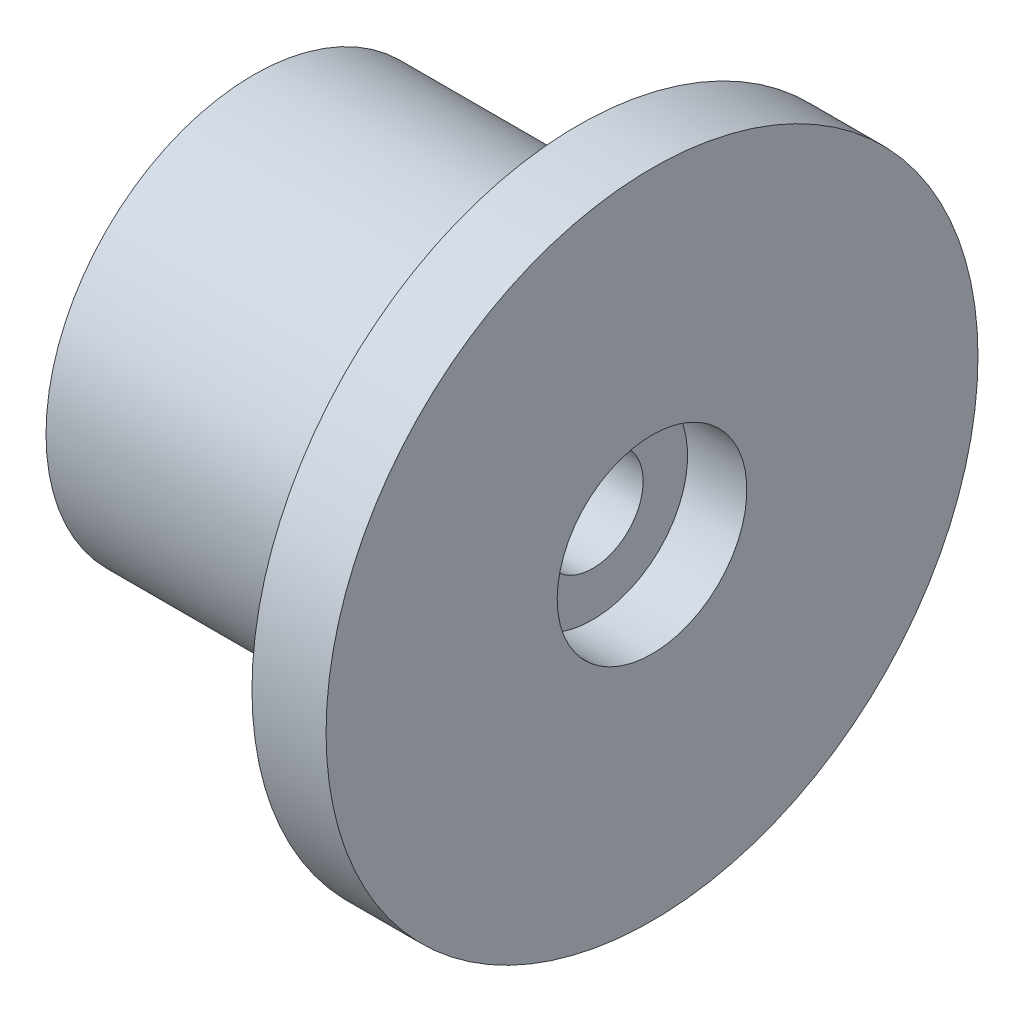
ISO-10303-21;
HEADER;
FILE_DESCRIPTION(('STEP AP214'),'2;1');
FILE_NAME('part.step','',(''),(''),'','','');
FILE_SCHEMA(('AUTOMOTIVE_DESIGN { 1 0 10303 214 1 1 1 1 }'));
ENDSEC;
DATA;
#1=APPLICATION_CONTEXT('core data for automotive mechanical design processes');
#2=APPLICATION_PROTOCOL_DEFINITION('international standard','automotive_design',2000,#1);
#3=PRODUCT_CONTEXT('',#1,'mechanical');
#4=PRODUCT('Part','Part','',(#3));
#5=PRODUCT_RELATED_PRODUCT_CATEGORY('part','',(#4));
#6=PRODUCT_DEFINITION_FORMATION('','',#4);
#7=PRODUCT_DEFINITION_CONTEXT('part definition',#1,'design');
#8=PRODUCT_DEFINITION('design','',#6,#7);
#9=PRODUCT_DEFINITION_SHAPE('','',#8);
#10=(LENGTH_UNIT() NAMED_UNIT(*) SI_UNIT(.MILLI.,.METRE.));
#11=(NAMED_UNIT(*) PLANE_ANGLE_UNIT() SI_UNIT($,.RADIAN.));
#12=(NAMED_UNIT(*) SI_UNIT($,.STERADIAN.) SOLID_ANGLE_UNIT());
#13=UNCERTAINTY_MEASURE_WITH_UNIT(LENGTH_MEASURE(1.E-05),#10,'distance_accuracy_value','');
#14=(GEOMETRIC_REPRESENTATION_CONTEXT(3) GLOBAL_UNCERTAINTY_ASSIGNED_CONTEXT((#13)) GLOBAL_UNIT_ASSIGNED_CONTEXT((#10,
#11,#12)) REPRESENTATION_CONTEXT('',''));
#15=CARTESIAN_POINT('',(0.,0.,0.));
#16=DIRECTION('',(0.,0.,1.));
#17=DIRECTION('',(1.,0.,0.));
#18=AXIS2_PLACEMENT_3D('',#15,#16,#17);
#19=CARTESIAN_POINT('',(-5.,0.,0.));
#20=DIRECTION('',(-1.,0.,0.));
#21=DIRECTION('',(0.,0.,1.));
#22=AXIS2_PLACEMENT_3D('',#19,#20,#21);
#23=CYLINDRICAL_SURFACE('',#22,1.7);
#24=CARTESIAN_POINT('',(11.45,0.,0.));
#25=DIRECTION('',(-1.,0.,0.));
#26=DIRECTION('',(0.,0.,1.));
#27=AXIS2_PLACEMENT_3D('',#24,#25,#26);
#28=CIRCLE('',#27,1.7);
#29=CARTESIAN_POINT('',(11.45,0.,1.7));
#30=VERTEX_POINT('',#29);
#31=EDGE_CURVE('E65',#30,#30,#28,.T.);
#32=ORIENTED_EDGE('',*,*,#31,.F.);
#33=EDGE_LOOP('',(#32));
#34=FACE_BOUND('',#33,.T.);
#35=CARTESIAN_POINT('',(0.,0.,0.));
#36=DIRECTION('',(-1.,0.,0.));
#37=DIRECTION('',(0.,0.,1.));
#38=AXIS2_PLACEMENT_3D('',#35,#36,#37);
#39=CIRCLE('',#38,1.7);
#40=CARTESIAN_POINT('',(0.,0.,1.7));
#41=VERTEX_POINT('',#40);
#42=EDGE_CURVE('E10',#41,#41,#39,.T.);
#43=ORIENTED_EDGE('',*,*,#42,.T.);
#44=EDGE_LOOP('',(#43));
#45=FACE_BOUND('',#44,.T.);
#46=ADVANCED_FACE('F40',(#34,#45),#23,.F.);
#47=CARTESIAN_POINT('',(0.,1.7,0.));
#48=DIRECTION('',(1.,0.,0.));
#49=DIRECTION('',(0.,0.,-1.));
#50=AXIS2_PLACEMENT_3D('',#47,#48,#49);
#51=PLANE('',#50);
#52=ORIENTED_EDGE('',*,*,#42,.F.);
#53=EDGE_LOOP('',(#52));
#54=FACE_BOUND('',#53,.T.);
#55=CARTESIAN_POINT('',(0.,0.,0.));
#56=DIRECTION('',(-1.,0.,0.));
#57=DIRECTION('',(0.,0.,1.));
#58=AXIS2_PLACEMENT_3D('',#55,#56,#57);
#59=CIRCLE('',#58,7.);
#60=CARTESIAN_POINT('',(0.,0.,7.));
#61=VERTEX_POINT('',#60);
#62=EDGE_CURVE('E43',#61,#61,#59,.T.);
#63=ORIENTED_EDGE('',*,*,#62,.T.);
#64=EDGE_LOOP('',(#63));
#65=FACE_BOUND('',#64,.T.);
#66=ADVANCED_FACE('F72',(#54,#65),#51,.F.);
#67=CARTESIAN_POINT('',(-5.,0.,0.));
#68=DIRECTION('',(-1.,0.,0.));
#69=DIRECTION('',(0.,0.,1.));
#70=AXIS2_PLACEMENT_3D('',#67,#68,#69);
#71=CYLINDRICAL_SURFACE('',#70,7.);
#72=ORIENTED_EDGE('',*,*,#62,.F.);
#73=EDGE_LOOP('',(#72));
#74=FACE_BOUND('',#73,.T.);
#75=CARTESIAN_POINT('',(10.95,0.,0.));
#76=DIRECTION('',(-1.,0.,0.));
#77=DIRECTION('',(0.,0.,1.));
#78=AXIS2_PLACEMENT_3D('',#75,#76,#77);
#79=CIRCLE('',#78,7.);
#80=CARTESIAN_POINT('',(10.95,0.,7.));
#81=VERTEX_POINT('',#80);
#82=EDGE_CURVE('E50',#81,#81,#79,.T.);
#83=ORIENTED_EDGE('',*,*,#82,.T.);
#84=EDGE_LOOP('',(#83));
#85=FACE_BOUND('',#84,.T.);
#86=ADVANCED_FACE('F78',(#74,#85),#71,.T.);
#87=CARTESIAN_POINT('',(10.95,7.,0.));
#88=DIRECTION('',(1.,0.,0.));
#89=DIRECTION('',(0.,0.,-1.));
#90=AXIS2_PLACEMENT_3D('',#87,#88,#89);
#91=PLANE('',#90);
#92=ORIENTED_EDGE('',*,*,#82,.F.);
#93=EDGE_LOOP('',(#92));
#94=FACE_BOUND('',#93,.T.);
#95=CARTESIAN_POINT('',(10.95,0.,0.));
#96=DIRECTION('',(-1.,0.,0.));
#97=DIRECTION('',(0.,0.,1.));
#98=AXIS2_PLACEMENT_3D('',#95,#96,#97);
#99=CIRCLE('',#98,11.);
#100=CARTESIAN_POINT('',(10.95,0.,11.));
#101=VERTEX_POINT('',#100);
#102=EDGE_CURVE('E51',#101,#101,#99,.T.);
#103=ORIENTED_EDGE('',*,*,#102,.T.);
#104=EDGE_LOOP('',(#103));
#105=FACE_BOUND('',#104,.T.);
#106=ADVANCED_FACE('F83',(#94,#105),#91,.F.);
#107=CARTESIAN_POINT('',(-5.,0.,0.));
#108=DIRECTION('',(-1.,0.,0.));
#109=DIRECTION('',(0.,0.,1.));
#110=AXIS2_PLACEMENT_3D('',#107,#108,#109);
#111=CYLINDRICAL_SURFACE('',#110,11.);
#112=ORIENTED_EDGE('',*,*,#102,.F.);
#113=EDGE_LOOP('',(#112));
#114=FACE_BOUND('',#113,.T.);
#115=CARTESIAN_POINT('',(13.45,0.,0.));
#116=DIRECTION('',(-1.,0.,0.));
#117=DIRECTION('',(0.,0.,1.));
#118=AXIS2_PLACEMENT_3D('',#115,#116,#117);
#119=CIRCLE('',#118,11.);
#120=CARTESIAN_POINT('',(13.45,0.,11.));
#121=VERTEX_POINT('',#120);
#122=EDGE_CURVE('E57',#121,#121,#119,.T.);
#123=ORIENTED_EDGE('',*,*,#122,.T.);
#124=EDGE_LOOP('',(#123));
#125=FACE_BOUND('',#124,.T.);
#126=ADVANCED_FACE('F90',(#114,#125),#111,.T.);
#127=CARTESIAN_POINT('',(13.45,11.,0.));
#128=DIRECTION('',(-1.,0.,0.));
#129=DIRECTION('',(0.,0.,1.));
#130=AXIS2_PLACEMENT_3D('',#127,#128,#129);
#131=PLANE('',#130);
#132=ORIENTED_EDGE('',*,*,#122,.F.);
#133=EDGE_LOOP('',(#132));
#134=FACE_BOUND('',#133,.T.);
#135=CARTESIAN_POINT('',(13.45,0.,0.));
#136=DIRECTION('',(-1.,0.,0.));
#137=DIRECTION('',(0.,0.,1.));
#138=AXIS2_PLACEMENT_3D('',#135,#136,#137);
#139=CIRCLE('',#138,3.2);
#140=CARTESIAN_POINT('',(13.45,0.,3.2));
#141=VERTEX_POINT('',#140);
#142=EDGE_CURVE('E56',#141,#141,#139,.T.);
#143=ORIENTED_EDGE('',*,*,#142,.T.);
#144=EDGE_LOOP('',(#143));
#145=FACE_BOUND('',#144,.T.);
#146=ADVANCED_FACE('F91',(#134,#145),#131,.F.);
#147=CARTESIAN_POINT('',(-5.,0.,0.));
#148=DIRECTION('',(-1.,0.,0.));
#149=DIRECTION('',(0.,0.,1.));
#150=AXIS2_PLACEMENT_3D('',#147,#148,#149);
#151=CYLINDRICAL_SURFACE('',#150,3.2);
#152=ORIENTED_EDGE('',*,*,#142,.F.);
#153=EDGE_LOOP('',(#152));
#154=FACE_BOUND('',#153,.T.);
#155=CARTESIAN_POINT('',(11.45,0.,0.));
#156=DIRECTION('',(-1.,0.,0.));
#157=DIRECTION('',(0.,0.,1.));
#158=AXIS2_PLACEMENT_3D('',#155,#156,#157);
#159=CIRCLE('',#158,3.2);
#160=CARTESIAN_POINT('',(11.45,0.,3.2));
#161=VERTEX_POINT('',#160);
#162=EDGE_CURVE('E62',#161,#161,#159,.T.);
#163=ORIENTED_EDGE('',*,*,#162,.T.);
#164=EDGE_LOOP('',(#163));
#165=FACE_BOUND('',#164,.T.);
#166=ADVANCED_FACE('F94',(#154,#165),#151,.F.);
#167=CARTESIAN_POINT('',(11.45,3.2,0.));
#168=DIRECTION('',(-1.,0.,0.));
#169=DIRECTION('',(0.,0.,1.));
#170=AXIS2_PLACEMENT_3D('',#167,#168,#169);
#171=PLANE('',#170);
#172=ORIENTED_EDGE('',*,*,#162,.F.);
#173=EDGE_LOOP('',(#172));
#174=FACE_BOUND('',#173,.T.);
#175=ORIENTED_EDGE('',*,*,#31,.T.);
#176=EDGE_LOOP('',(#175));
#177=FACE_BOUND('',#176,.T.);
#178=ADVANCED_FACE('F69',(#174,#177),#171,.F.);
#179=CLOSED_SHELL('',(#46,#66,#86,#106,#126,#146,#166,#178));
#180=MANIFOLD_SOLID_BREP('B2',#179);
#181=ADVANCED_BREP_SHAPE_REPRESENTATION('',(#18,#180),#14);
#182=SHAPE_DEFINITION_REPRESENTATION(#9,#181);
ENDSEC;
END-ISO-10303-21;
